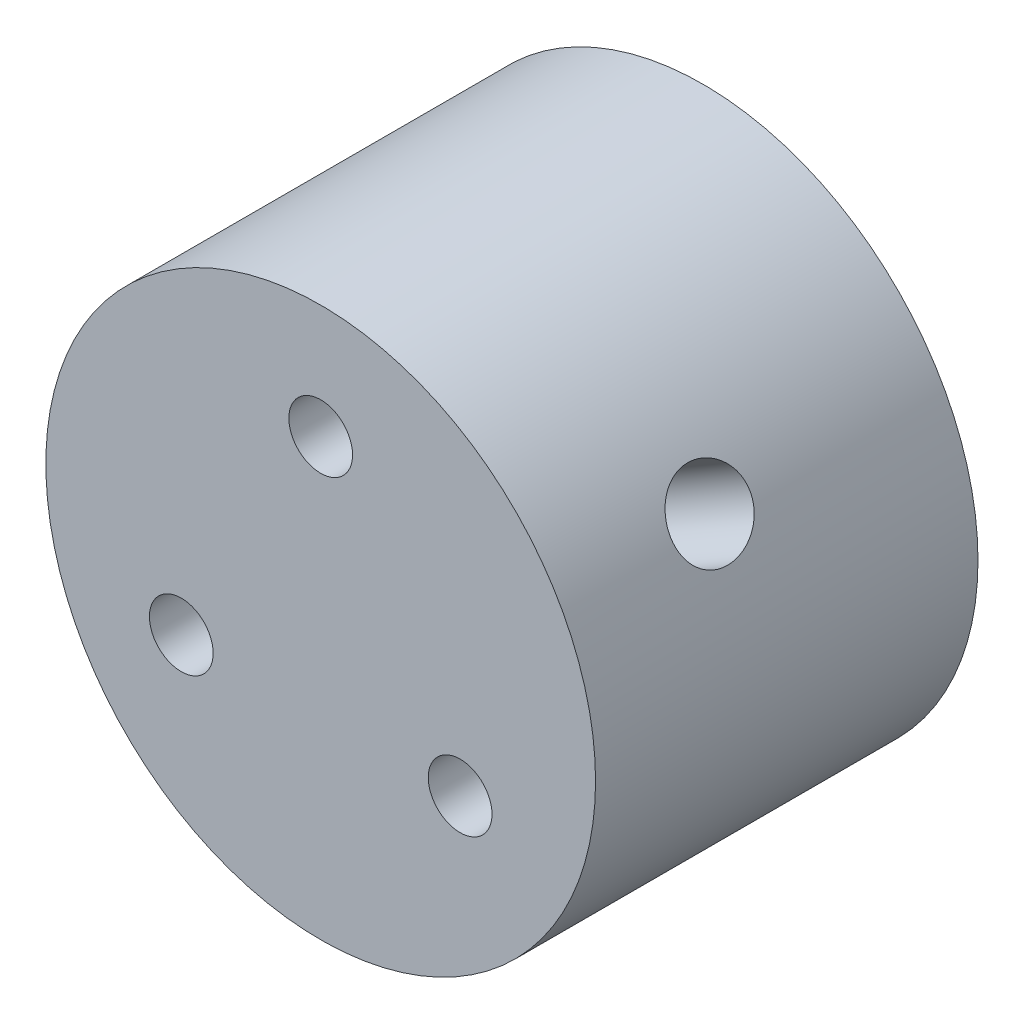
ISO-10303-21;
HEADER;
FILE_DESCRIPTION(('STEP AP214'),'2;1');
FILE_NAME('part.step','',(''),(''),'','','');
FILE_SCHEMA(('AUTOMOTIVE_DESIGN { 1 0 10303 214 1 1 1 1 }'));
ENDSEC;
DATA;
#1=APPLICATION_CONTEXT('core data for automotive mechanical design processes');
#2=APPLICATION_PROTOCOL_DEFINITION('international standard','automotive_design',2000,#1);
#3=PRODUCT_CONTEXT('',#1,'mechanical');
#4=PRODUCT('Part','Part','',(#3));
#5=PRODUCT_RELATED_PRODUCT_CATEGORY('part','',(#4));
#6=PRODUCT_DEFINITION_FORMATION('','',#4);
#7=PRODUCT_DEFINITION_CONTEXT('part definition',#1,'design');
#8=PRODUCT_DEFINITION('design','',#6,#7);
#9=PRODUCT_DEFINITION_SHAPE('','',#8);
#10=(LENGTH_UNIT() NAMED_UNIT(*) SI_UNIT(.MILLI.,.METRE.));
#11=(NAMED_UNIT(*) PLANE_ANGLE_UNIT() SI_UNIT($,.RADIAN.));
#12=(NAMED_UNIT(*) SI_UNIT($,.STERADIAN.) SOLID_ANGLE_UNIT());
#13=UNCERTAINTY_MEASURE_WITH_UNIT(LENGTH_MEASURE(1.E-05),#10,'distance_accuracy_value','');
#14=(GEOMETRIC_REPRESENTATION_CONTEXT(3) GLOBAL_UNCERTAINTY_ASSIGNED_CONTEXT((#13)) GLOBAL_UNIT_ASSIGNED_CONTEXT((#10,
#11,#12)) REPRESENTATION_CONTEXT('',''));
#15=CARTESIAN_POINT('',(0.,0.,0.));
#16=DIRECTION('',(0.,0.,1.));
#17=DIRECTION('',(1.,0.,0.));
#18=AXIS2_PLACEMENT_3D('',#15,#16,#17);
#19=CARTESIAN_POINT('',(0.,0.,48.));
#20=DIRECTION('',(0.,0.,-1.));
#21=DIRECTION('',(-1.,0.,0.));
#22=AXIS2_PLACEMENT_3D('',#19,#20,#21);
#23=CYLINDRICAL_SURFACE('',#22,34.5);
#24=CARTESIAN_POINT('',(-27.0624339322728,21.3980062076206,29.));
#25=CARTESIAN_POINT('',(-27.062432378259,21.3980074335611,29.1396811536221));
#26=CARTESIAN_POINT('',(-27.066105505621,21.3933649615511,29.279336303075));
#27=CARTESIAN_POINT('',(-27.0807519140724,21.3748221823608,29.5576893388665));
#28=CARTESIAN_POINT('',(-27.091726758129,21.360919893072,29.6963870138294));
#29=CARTESIAN_POINT('',(-27.1208594669716,21.3239192747357,29.9718821731124));
#30=CARTESIAN_POINT('',(-27.1390223267007,21.3008145508563,30.1086782674564));
#31=CARTESIAN_POINT('',(-27.1823242689643,21.2455284651499,30.3793537740703));
#32=CARTESIAN_POINT('',(-27.207465909831,21.2133437746523,30.5132320972744));
#33=CARTESIAN_POINT('',(-27.2643987102191,21.1401208395038,30.7769264216718));
#34=CARTESIAN_POINT('',(-27.2961823553729,21.0990925982832,30.9067468245692));
#35=CARTESIAN_POINT('',(-27.3660682832039,21.0083693903759,31.1616259617749));
#36=CARTESIAN_POINT('',(-27.4041728937342,20.9586712304259,31.2866829208852));
#37=CARTESIAN_POINT('',(-27.4862480899361,20.8509171943618,31.5310568049867));
#38=CARTESIAN_POINT('',(-27.5302155934857,20.79286570833,31.6503767014127));
#39=CARTESIAN_POINT('',(-27.623573979753,20.6686766618153,31.8825727148244));
#40=CARTESIAN_POINT('',(-27.672966873776,20.6025361015062,31.9954464183422));
#41=CARTESIAN_POINT('',(-27.776970731533,20.4621009946115,32.2146237177126));
#42=CARTESIAN_POINT('',(-27.831612716077,20.3877575319849,32.3208812550878));
#43=CARTESIAN_POINT('',(-27.9453025481956,20.23164329573,32.5253467604931));
#44=CARTESIAN_POINT('',(-28.004352018596,20.1498697839432,32.6235517353811));
#45=CARTESIAN_POINT('',(-28.1262231320909,19.9794029893045,32.8111579681905));
#46=CARTESIAN_POINT('',(-28.1890435872609,19.8907118830048,32.9005619753809));
#47=CARTESIAN_POINT('',(-28.3178791557431,19.7068597864432,33.0700074073955));
#48=CARTESIAN_POINT('',(-28.3838954386103,19.6116964223353,33.1500453674104));
#49=CARTESIAN_POINT('',(-28.5187467165314,19.4150804874584,33.3004633455947));
#50=CARTESIAN_POINT('',(-28.5875922056008,19.3136036168492,33.370802207607));
#51=CARTESIAN_POINT('',(-28.7272222380825,19.1052985706319,33.5009441983494));
#52=CARTESIAN_POINT('',(-28.798007492842,18.99846841965,33.5607434005993));
#53=CARTESIAN_POINT('',(-28.9408224951166,18.780196348426,33.6693112397603));
#54=CARTESIAN_POINT('',(-29.0128517220236,18.6687563314362,33.7180843762251));
#55=CARTESIAN_POINT('',(-29.157547350558,18.4419519854754,33.8042801186226));
#56=CARTESIAN_POINT('',(-29.2302139756485,18.3265862357531,33.8416985655615));
#57=CARTESIAN_POINT('',(-29.4471550533404,17.9774678759682,33.935961705267));
#58=CARTESIAN_POINT('',(-29.5915453473279,17.7389054260518,33.9757015416059));
#59=CARTESIAN_POINT('',(-29.8756808704555,17.2560800139875,34.0078723393638));
#60=CARTESIAN_POINT('',(-30.0154263410687,17.0118173493073,34.0003057640073));
#61=CARTESIAN_POINT('',(-30.2854075278283,16.5263614845206,33.9383998980575));
#62=CARTESIAN_POINT('',(-30.4157066743588,16.2851590006362,33.8844116255055));
#63=CARTESIAN_POINT('',(-30.6648018210252,15.8111255500393,33.7317286681408));
#64=CARTESIAN_POINT('',(-30.7835975411898,15.5782947871652,33.6330328955648));
#65=CARTESIAN_POINT('',(-31.0077643383555,15.127203064434,33.3933785432124));
#66=CARTESIAN_POINT('',(-31.1130862894942,14.908996728946,33.2522712580146));
#67=CARTESIAN_POINT('',(-31.3082104672409,14.4947736287041,32.9319066846693));
#68=CARTESIAN_POINT('',(-31.3980117386625,14.2987582298993,32.7526470500322));
#69=CARTESIAN_POINT('',(-31.5618486944441,13.93342162128,32.3591082918331));
#70=CARTESIAN_POINT('',(-31.6357320435591,13.7643620513244,32.1445227242422));
#71=CARTESIAN_POINT('',(-31.7661125038639,13.4607386472375,31.6874669495281));
#72=CARTESIAN_POINT('',(-31.8226095210322,13.3261749996533,31.4449965916197));
#73=CARTESIAN_POINT('',(-31.9179803945846,13.0961109976948,30.9387485144721));
#74=CARTESIAN_POINT('',(-31.9568420100665,13.0006377808448,30.6749561445886));
#75=CARTESIAN_POINT('',(-32.0167715895902,12.8523458602228,30.1337165816403));
#76=CARTESIAN_POINT('',(-32.0378407203525,12.7995243596263,29.8562702851778));
#77=CARTESIAN_POINT('',(-32.0620443347773,12.7387750297312,29.2982879233041));
#78=CARTESIAN_POINT('',(-32.0653394388819,12.7304451450529,29.0178025611778));
#79=CARTESIAN_POINT('',(-32.0544233532874,12.7579055206322,28.4593508668561));
#80=CARTESIAN_POINT('',(-32.0402126694863,12.7936945059026,28.1813844620994));
#81=CARTESIAN_POINT('',(-31.994412770818,12.9077985493021,27.6371791758897));
#82=CARTESIAN_POINT('',(-31.9629045566277,12.9859153731322,27.3708918327572));
#83=CARTESIAN_POINT('',(-31.8826341898198,13.1817590032483,26.8560779496545));
#84=CARTESIAN_POINT('',(-31.8338712375033,13.2994876453959,26.6075522335174));
#85=CARTESIAN_POINT('',(-31.7188709520665,13.5714810777314,26.133391586281));
#86=CARTESIAN_POINT('',(-31.6525129444351,13.7259973964214,25.907930236263));
#87=CARTESIAN_POINT('',(-31.5028991727562,14.0659784301217,25.4880799299139));
#88=CARTESIAN_POINT('',(-31.4196425186108,14.251444775263,25.2936926113016));
#89=CARTESIAN_POINT('',(-31.2363159262727,14.6489163450975,24.9399763822613));
#90=CARTESIAN_POINT('',(-31.1361206541505,14.8611161546788,24.7809309273419));
#91=CARTESIAN_POINT('',(-30.9207465939507,15.3041822423588,24.5043863838868));
#92=CARTESIAN_POINT('',(-30.8055681934024,15.5350480376148,24.3868862210999));
#93=CARTESIAN_POINT('',(-30.5627862598416,16.0073848505066,24.1972189604037));
#94=CARTESIAN_POINT('',(-30.4352275221049,16.2488160174629,24.1248949847653));
#95=CARTESIAN_POINT('',(-30.1701535162243,16.735843890318,24.0271430586428));
#96=CARTESIAN_POINT('',(-30.0326388606292,16.9814403392325,24.0017122255506));
#97=CARTESIAN_POINT('',(-29.8225481612858,17.3460453379166,23.9992737523232));
#98=CARTESIAN_POINT('',(-29.7521772013637,17.4664634717714,24.0043196651362));
#99=CARTESIAN_POINT('',(-29.6104584943827,17.7056488234044,24.0260392538203));
#100=CARTESIAN_POINT('',(-29.5391111222391,17.8244166414082,24.0427085829848));
#101=CARTESIAN_POINT('',(-29.395960977944,18.0595251232147,24.0875629399824));
#102=CARTESIAN_POINT('',(-29.324158051117,18.1758648979859,24.1157521106829));
#103=CARTESIAN_POINT('',(-29.1807233893489,18.4052620343925,24.1834202629379));
#104=CARTESIAN_POINT('',(-29.1090916018578,18.5183205686913,24.2228951550347));
#105=CARTESIAN_POINT('',(-28.9665969724545,18.7404286939835,24.3128350674625));
#106=CARTESIAN_POINT('',(-28.895733916404,18.8494794227155,24.3632969401914));
#107=CARTESIAN_POINT('',(-28.7553963055681,19.0628824679722,24.4748300814823));
#108=CARTESIAN_POINT('',(-28.6859212595868,19.167236463586,24.5358975199888));
#109=CARTESIAN_POINT('',(-28.5489288627992,19.3706920160596,24.6682429350668));
#110=CARTESIAN_POINT('',(-28.4814122617839,19.4697915729706,24.7395247617651));
#111=CARTESIAN_POINT('',(-28.3490092534541,19.662077669385,24.8917525203313));
#112=CARTESIAN_POINT('',(-28.2841219200766,19.7552662974506,24.9726950092494));
#113=CARTESIAN_POINT('',(-28.156986957563,19.9360580658387,25.1444844123258));
#114=CARTESIAN_POINT('',(-28.0947688105816,20.0236024944788,25.2354149469377));
#115=CARTESIAN_POINT('',(-27.974245605206,20.1916386765307,25.4258978837172));
#116=CARTESIAN_POINT('',(-27.9159391455184,20.2721329587254,25.5254471687795));
#117=CARTESIAN_POINT('',(-27.8037719827395,20.4257022637268,25.7325697162863));
#118=CARTESIAN_POINT('',(-27.7499139766517,20.4987727917542,25.8401477722614));
#119=CARTESIAN_POINT('',(-27.6472638877794,20.6370107143001,26.062490734272));
#120=CARTESIAN_POINT('',(-27.5984699422377,20.7021810163198,26.1772529726062));
#121=CARTESIAN_POINT('',(-27.506189498586,20.8246357184986,26.4138704555592));
#122=CARTESIAN_POINT('',(-27.4627343144749,20.8818738224466,26.5357618836751));
#123=CARTESIAN_POINT('',(-27.3819510461969,20.9876913495253,26.7851441504622));
#124=CARTESIAN_POINT('',(-27.3446207111576,21.0362739541047,26.9126329101909));
#125=CARTESIAN_POINT('',(-27.2765186229426,21.1245032901575,27.1722575429742));
#126=CARTESIAN_POINT('',(-27.2457419916817,21.1641566691486,27.3043898737517));
#127=CARTESIAN_POINT('',(-27.1910778142365,21.2343415285726,27.5724011690972));
#128=CARTESIAN_POINT('',(-27.1671887059592,21.2648750774432,27.70827927645));
#129=CARTESIAN_POINT('',(-27.1189534124847,21.3263792814157,28.0343993732283));
#130=CARTESIAN_POINT('',(-27.0977965823854,21.3532183302098,28.2259162745531));
#131=CARTESIAN_POINT('',(-27.0695380042923,21.3890308370826,28.6116388854967));
#132=CARTESIAN_POINT('',(-27.0624360923367,21.3980045035753,28.8058445637222));
#133=CARTESIAN_POINT('',(-27.0624339322728,21.3980062076206,29.));
#134=B_SPLINE_CURVE_WITH_KNOTS('',3,(#24,#25,#26,#27,#28,#29,#30,#31,#32,#33,#34,#35,#36,#37,
#38,#39,#40,#41,#42,#43,#44,#45,#46,#47,#48,#49,#50,#51,#52,#53,#54,#55,#56,#57,#58,#59,#60,#61,
#62,#63,#64,#65,#66,#67,#68,#69,#70,#71,#72,#73,#74,#75,#76,#77,#78,#79,#80,#81,#82,#83,#84,#85,
#86,#87,#88,#89,#90,#91,#92,#93,#94,#95,#96,#97,#98,#99,#100,#101,#102,#103,#104,#105,#106,#107,
#108,#109,#110,#111,#112,#113,#114,#115,#116,#117,#118,#119,#120,#121,#122,#123,#124,#125,#126,
#127,#128,#129,#130,#131,#132,#133),.UNSPECIFIED.,.T.,.F.,(4,2,2,2,2,2,2,2,2,2,2,2,2,2,2,2,2,2,
2,2,2,2,2,2,2,2,2,2,2,2,2,2,2,2,2,2,2,2,2,2,2,2,2,2,2,2,2,2,2,2,2,2,2,2,4),(0.,
0.418873384797761,0.837836460289055,1.25709118533762,1.67649980724655,2.09543647942797,
2.51452777940979,2.93339962539417,3.35242728336616,3.77410460824125,4.19593796694443,
4.61763913128664,5.03949580689117,5.46309081168777,5.88684329195409,6.31042253247804,
6.7341567347837,7.57476445837881,8.41532841225428,9.2495917747853,10.0838754365914,
10.921119124664,11.7584143207467,12.6033977804718,13.4483858096019,14.2939594593115,
15.1394776572507,15.9773421091499,16.8151823482507,17.6491322170659,18.4831207417042,
19.3229841045516,20.1628917167849,21.0093103218027,21.8557070390787,22.6991479969593,
23.5425371052365,23.9608212293198,24.3789490152013,24.7972273044072,25.2153542193204,
25.6333615045102,26.0512181447876,26.4692327048201,26.8870987316,27.3087769082443,
27.7303032104317,28.1520832273616,28.573707543284,28.9976974287552,29.4215311478941,
29.8450482857167,30.2684692939876,30.8507059910492,31.432935895812),.UNSPECIFIED.);
#135=CARTESIAN_POINT('',(-27.0624339322728,21.3980062076206,29.));
#136=VERTEX_POINT('',#135);
#137=EDGE_CURVE('E69',#136,#136,#134,.T.);
#138=ORIENTED_EDGE('',*,*,#137,.T.);
#139=EDGE_LOOP('',(#138));
#140=FACE_BOUND('',#139,.T.);
#141=CARTESIAN_POINT('',(32.062433932273,12.7377521697758,29.));
#142=CARTESIAN_POINT('',(32.0624342169618,12.7377502109901,29.1396811536221));
#143=CARTESIAN_POINT('',(32.0602502819457,12.7432524686019,29.279336303075));
#144=CARTESIAN_POINT('',(32.0515149683359,12.7652080199902,29.5576893388665));
#145=CARTESIAN_POINT('',(32.0449626546693,12.7816636583902,29.6963870138294));
#146=CARTESIAN_POINT('',(32.0274855336556,12.8253936334971,29.9718821731124));
#147=CARTESIAN_POINT('',(32.0165576856932,12.8526754933675,30.1086782674564));
#148=CARTESIAN_POINT('',(31.9903295021274,12.9178191182543,30.3793537740703));
#149=CARTESIAN_POINT('',(31.9750275629769,12.9556847631864,30.5132320972744));
#150=CARTESIAN_POINT('',(31.9400810411927,13.0416014822053,30.7769264216718));
#151=CARTESIAN_POINT('',(31.9204413646,13.0896410469438,30.9067468245692));
#152=CARTESIAN_POINT('',(31.8768157257549,13.1955256397661,31.1616259617749));
#153=CARTESIAN_POINT('',(31.852828161982,13.2533742804617,31.2866829208852));
#154=CARTESIAN_POINT('',(31.8005480274912,13.3783305034251,31.5310568049867));
#155=CARTESIAN_POINT('',(31.772257717635,13.445433221456,31.6503767014127));
#156=CARTESIAN_POINT('',(31.7113860416152,13.5883784788771,31.8825727148244));
#157=CARTESIAN_POINT('',(31.6788030831785,13.664224260022,31.9954464183422));
#158=CARTESIAN_POINT('',(31.609184641903,13.8245117963785,32.2146237177126));
#159=CARTESIAN_POINT('',(31.572122306935,13.9090048744201,32.3208812550878));
#160=CARTESIAN_POINT('',(31.4937683285052,14.0855202753143,32.5253467604931));
#161=CARTESIAN_POINT('',(31.4524751251414,14.1775453726544,32.6235517353811));
#162=CARTESIAN_POINT('',(31.36578210723,14.3683222502479,32.8111579681905));
#163=CARTESIAN_POINT('',(31.3203835836697,14.4670719134522,32.9005619753809));
#164=CARTESIAN_POINT('',(31.2255807817494,14.6705728369496,33.0700074073955));
#165=CARTESIAN_POINT('',(31.176175032356,14.77532629703,33.1500453674104));
#166=CARTESIAN_POINT('',(31.0733262769243,14.9904188968809,33.3004633455947));
#167=CARTESIAN_POINT('',(31.0198674736149,15.1007792746556,33.370802207607));
#168=CARTESIAN_POINT('',(30.9092850280951,15.3258549530246,33.5009441983494));
#169=CARTESIAN_POINT('',(30.8521600308344,15.4405718573507,33.5607434005993));
#170=CARTESIAN_POINT('',(30.734538373355,15.6733893129739,33.6693112397603));
#171=CARTESIAN_POINT('',(30.6740431010972,15.7914884617853,33.7180843762251));
#172=CARTESIAN_POINT('',(30.5499725900736,16.0302007248931,33.8042801186226));
#173=CARTESIAN_POINT('',(30.4863962326327,16.1508147430898,33.8416985655615));
#174=CARTESIAN_POINT('',(30.2925214029775,16.5132504073879,33.935961705267));
#175=CARTESIAN_POINT('',(30.1581154079545,16.7575772949991,33.9757015416059));
#176=CARTESIAN_POINT('',(29.882044097078,17.2450585821774,34.0078723393638));
#177=CARTESIAN_POINT('',(29.7403791595754,17.4882130421323,34.0003057640073));
#178=CARTESIAN_POINT('',(29.4549526416338,17.9647515408033,33.9383998980575));
#179=CARTESIAN_POINT('',(29.3112147363992,18.1981951537324,33.8844116255055));
#180=CARTESIAN_POINT('',(29.025237299272,18.6509346040034,33.7317286681408));
#181=CARTESIAN_POINT('',(28.8829978039227,18.8702300969638,33.6330328955648));
#182=CARTESIAN_POINT('',(28.6044243111835,19.2899100993599,33.3933785432124));
#183=CARTESIAN_POINT('',(28.4681130569535,19.4902247523662,33.2522712580146));
#184=CARTESIAN_POINT('',(28.2069474181831,19.8663187973083,32.9319066846693));
#185=CARTESIAN_POINT('',(28.082093738996,20.042096679054,32.7526470500322));
#186=CARTESIAN_POINT('',(27.84762143289,20.3666519491492,32.3591082918331));
#187=CARTESIAN_POINT('',(27.7381532251131,20.5151665913773,32.1445227242422));
#188=CARTESIAN_POINT('',(27.5403978741427,20.7798910842017,31.6874669495281));
#189=CARTESIAN_POINT('',(27.452110845493,20.8961007600997,31.4449965916197));
#190=CARTESIAN_POINT('',(27.3005550120768,21.0937263603564,30.9387485144721));
#191=CARTESIAN_POINT('',(27.2373035886447,21.1751181150209,30.6749561445886));
#192=CARTESIAN_POINT('',(27.1388438079719,21.3011646136375,30.1337165816403));
#193=CARTESIAN_POINT('',(27.1036336119705,21.3458217664115,29.8562702851778));
#194=CARTESIAN_POINT('',(27.0631249562308,21.3971573763144,29.2982879233041));
#195=CARTESIAN_POINT('',(27.0575586165412,21.4041759625162,29.0178025611778));
#196=CARTESIAN_POINT('',(27.075881956593,21.3809921672918,28.4593508668561));
#197=CARTESIAN_POINT('',(27.0997707851123,21.3507908614798,28.1813844620994));
#198=CARTESIAN_POINT('',(27.1756878360366,21.2540749640424,27.6371791758897));
#199=CARTESIAN_POINT('',(27.2275848828413,21.1877296382107,27.3708918327573));
#200=CARTESIAN_POINT('',(27.3570552582872,21.0202916463259,26.8560779496545));
#201=CARTESIAN_POINT('',(27.4346297769819,20.9191973697826,26.6075522335174));
#202=CARTESIAN_POINT('',(27.6126828563285,20.683607484984,26.133391586281));
#203=CARTESIAN_POINT('',(27.7133189097977,20.5488816052857,25.907930236263));
#204=CARTESIAN_POINT('',(27.9329442359476,20.2493217614057,25.4880799299139));
#205=CARTESIAN_POINT('',(28.0519344753143,20.0844862113111,25.2936926113016));
#206=CARTESIAN_POINT('',(28.3044916559039,19.7269849402397,24.9399763822613));
#207=CARTESIAN_POINT('',(28.4381644456185,19.5341133844521,24.7809309273419));
#208=CARTESIAN_POINT('',(28.7141839030048,19.1260609331629,24.5043863838868));
#209=CARTESIAN_POINT('',(28.8565303462873,18.9108806146928,24.3868862210999));
#210=CARTESIAN_POINT('',(29.1441950586138,18.4644568862033,24.1972189604037));
#211=CARTESIAN_POINT('',(29.2895012135949,18.2332721953705,24.1248949847653));
#212=CARTESIAN_POINT('',(29.5787427208982,17.7601974359675,24.0271430586428));
#213=CARTESIAN_POINT('',(29.7226781569399,17.5183080263723,24.0017122255506));
#214=CARTESIAN_POINT('',(29.9333899984754,17.1540616442999,23.9992737523232));
#215=CARTESIAN_POINT('',(30.0024896815089,17.0329095383913,24.0043196651362));
#216=CARTESIAN_POINT('',(30.1387709187457,16.7905848621378,24.0260392538203));
#217=CARTESIAN_POINT('',(30.2059531802172,16.6694123163663,24.0427085829848));
#218=CARTESIAN_POINT('',(30.3379880259593,16.4278864139481,24.0875629399824));
#219=CARTESIAN_POINT('',(30.4028397629682,16.3075333678642,24.1157521106829));
#220=CARTESIAN_POINT('',(30.5297861797677,16.0686167387865,24.1834202629379));
#221=CARTESIAN_POINT('',(30.5918818488395,15.9500525239513,24.2228951550347));
#222=CARTESIAN_POINT('',(30.7129858130278,15.7155944923391,24.3128350674625));
#223=CARTESIAN_POINT('',(30.7719949863857,15.5996999212436,24.3632969401914));
#224=CARTESIAN_POINT('',(30.8866386394051,15.3714624625249,24.4748300814823));
#225=CARTESIAN_POINT('',(30.9422743276024,15.2591183099692,24.5358975199888));
#226=CARTESIAN_POINT('',(31.0499758061917,15.0387516379889,24.6682429350668));
#227=CARTESIAN_POINT('',(31.1020402394728,14.930730767877,24.7395247617651));
#228=CARTESIAN_POINT('',(31.2023633795973,14.7199233509187,24.8917525203313));
#229=CARTESIAN_POINT('',(31.2506234321571,14.6171349577972,24.9726950092494));
#230=CARTESIAN_POINT('',(31.3436262151196,14.4166369663572,25.1444844123258));
#231=CARTESIAN_POINT('',(31.388332840791,14.3189822561748,25.2354149469377));
#232=CARTESIAN_POINT('',(31.4735948405151,14.1305880075481,25.4258978837172));
#233=CARTESIAN_POINT('',(31.5141517039112,14.0398459911566,25.5254471687795));
#234=CARTESIAN_POINT('',(31.5910630418945,13.8659217262189,25.7325697162863));
#235=CARTESIAN_POINT('',(31.6274149723903,13.782744060736,25.8401477722614));
#236=CARTESIAN_POINT('',(31.6958074806453,13.6247275147989,26.062490734272));
#237=CARTESIAN_POINT('',(31.7278496449958,13.549885567399,26.1772529726062));
#238=CARTESIAN_POINT('',(31.7877583060697,13.4087410078348,26.4138704555592));
#239=CARTESIAN_POINT('',(31.8156003660975,13.3424886624944,26.5357618836751));
#240=CARTESIAN_POINT('',(31.8668493985743,13.2196195364257,26.7851441504622));
#241=CARTESIAN_POINT('',(31.8902580008024,13.1629992156601,26.9126329101909));
#242=CARTESIAN_POINT('',(31.9326158030757,13.0599064091887,27.1722575429742));
#243=CARTESIAN_POINT('',(31.9515683209974,13.0134263751783,27.3043898737517));
#244=CARTESIAN_POINT('',(31.985018103497,12.9309933791218,27.5724011690972));
#245=CARTESIAN_POINT('',(31.999516378348,12.8950380300446,27.70827927645));
#246=CARTESIAN_POINT('',(32.0286629346905,12.8225129385504,28.0343993732283));
#247=CARTESIAN_POINT('',(32.04132781771,12.7907710618238,28.2259162745531));
#248=CARTESIAN_POINT('',(32.0582130693885,12.748392161884,28.6116388854967));
#249=CARTESIAN_POINT('',(32.0624335365584,12.7377548924687,28.8058445637222));
#250=CARTESIAN_POINT('',(32.062433932273,12.7377521697758,29.));
#251=B_SPLINE_CURVE_WITH_KNOTS('',3,(#141,#142,#143,#144,#145,#146,#147,#148,#149,#150,#151,
#152,#153,#154,#155,#156,#157,#158,#159,#160,#161,#162,#163,#164,#165,#166,#167,#168,#169,#170,
#171,#172,#173,#174,#175,#176,#177,#178,#179,#180,#181,#182,#183,#184,#185,#186,#187,#188,#189,
#190,#191,#192,#193,#194,#195,#196,#197,#198,#199,#200,#201,#202,#203,#204,#205,#206,#207,#208,
#209,#210,#211,#212,#213,#214,#215,#216,#217,#218,#219,#220,#221,#222,#223,#224,#225,#226,#227,
#228,#229,#230,#231,#232,#233,#234,#235,#236,#237,#238,#239,#240,#241,#242,#243,#244,#245,#246,
#247,#248,#249,#250),.UNSPECIFIED.,.T.,.F.,(4,2,2,2,2,2,2,2,2,2,2,2,2,2,2,2,2,2,2,2,2,2,2,2,2,2,
2,2,2,2,2,2,2,2,2,2,2,2,2,2,2,2,2,2,2,2,2,2,2,2,2,2,2,2,4),(0.,0.418873384797761,
0.837836460289055,1.25709118533762,1.67649980724655,2.09543647942797,2.51452777940979,
2.93339962539417,3.35242728336616,3.77410460824125,4.19593796694443,4.61763913128663,
5.03949580689117,5.46309081168778,5.88684329195409,6.31042253247804,6.73415673478369,
7.57476445837881,8.41532841225427,9.24959177478529,10.0838754365914,10.921119124664,
11.7584143207467,12.6033977804718,13.4483858096019,14.2939594593115,15.1394776572507,
15.9773421091499,16.8151823482507,17.6491322170659,18.4831207417042,19.3229841045516,
20.1628917167849,21.0093103218027,21.8557070390787,22.6991479969593,23.5425371052365,
23.9608212293198,24.3789490152013,24.7972273044073,25.2153542193204,25.6333615045102,
26.0512181447876,26.4692327048201,26.8870987316,27.3087769082443,27.7303032104317,
28.1520832273616,28.573707543284,28.9976974287552,29.4215311478941,29.8450482857167,
30.2684692939876,30.8507059910492,31.432935895812),.UNSPECIFIED.);
#252=CARTESIAN_POINT('',(32.062433932273,12.7377521697758,29.));
#253=VERTEX_POINT('',#252);
#254=EDGE_CURVE('E60',#253,#253,#251,.T.);
#255=ORIENTED_EDGE('',*,*,#254,.T.);
#256=EDGE_LOOP('',(#255));
#257=FACE_BOUND('',#256,.T.);
#258=CARTESIAN_POINT('',(0.,-34.5,34.));
#259=CARTESIAN_POINT('',(0.139689818065339,-34.5000007051837,34.0000018370424));
#260=CARTESIAN_POINT('',(0.279353632082252,-34.4991499702517,33.9941440552333));
#261=CARTESIAN_POINT('',(0.557724230848582,-34.4957723113589,33.9707593887931));
#262=CARTESIAN_POINT('',(0.69643080437194,-34.4932450286902,33.9532300069466));
#263=CARTESIAN_POINT('',(0.9719439548344,-34.4865819187669,33.9066140930778));
#264=CARTESIAN_POINT('',(1.10874914433517,-34.482444974839,33.8775195376229));
#265=CARTESIAN_POINT('',(1.37944303424332,-34.4726773851782,33.8079799169434));
#266=CARTESIAN_POINT('',(1.51333064612,-34.4670461919359,33.7675306909279));
#267=CARTESIAN_POINT('',(1.77704472979558,-34.4544557497779,33.6756377343697));
#268=CARTESIAN_POINT('',(1.90687556257476,-34.447497988382,33.6242063108115));
#269=CARTESIAN_POINT('',(2.16177466440575,-34.4324416554255,33.5106765747636));
#270=CARTESIAN_POINT('',(2.28684115811077,-34.424342663787,33.448574332576));
#271=CARTESIAN_POINT('',(2.53123241001508,-34.4072356059039,33.3141973235436));
#272=CARTESIAN_POINT('',(2.65056014594458,-34.3982280187944,33.2419279103595));
#273=CARTESIAN_POINT('',(2.88276968674275,-34.3795464506311,33.0876735786396));
#274=CARTESIAN_POINT('',(2.99564907748692,-34.369872222953,33.0056850563433));
#275=CARTESIAN_POINT('',(3.21481859626601,-34.350067327095,32.8320500764228));
#276=CARTESIAN_POINT('',(3.32106376247753,-34.3399342105896,32.740347140934));
#277=CARTESIAN_POINT('',(3.52550441384206,-34.3195480494129,32.5483087166174));
#278=CARTESIAN_POINT('',(3.62369690595885,-34.309294961754,32.4479700461838));
#279=CARTESIAN_POINT('',(3.81127871723102,-34.2889640361817,32.2394164002987));
#280=CARTESIAN_POINT('',(3.90067076798666,-34.2788861446935,32.1312038870894));
#281=CARTESIAN_POINT('',(4.07009320913557,-34.2591829966624,31.9075808933052));
#282=CARTESIAN_POINT('',(4.15012013422061,-34.2495579084498,31.7921677724085));
#283=CARTESIAN_POINT('',(4.30052559630811,-34.2309983602264,31.5544748261872));
#284=CARTESIAN_POINT('',(4.37086190945984,-34.2220669922425,31.432168031613));
#285=CARTESIAN_POINT('',(4.50099854006384,-34.2051943307637,31.181950754193));
#286=CARTESIAN_POINT('',(4.5607949307969,-34.1972534065861,31.0540382049524));
#287=CARTESIAN_POINT('',(4.66935698501973,-34.1825995890939,30.7935968639766));
#288=CARTESIAN_POINT('',(4.71812716140857,-34.1758861935822,30.6610699865545));
#289=CARTESIAN_POINT('',(4.80431687270855,-34.1638757287357,30.3922985865416));
#290=CARTESIAN_POINT('',(4.84173224969594,-34.158579178308,30.2560527219815));
#291=CARTESIAN_POINT('',(4.93598669808496,-34.145135397486,29.8452232563782));
#292=CARTESIAN_POINT('',(4.97571984693311,-34.1393102818569,29.5664150690971));
#293=CARTESIAN_POINT('',(5.00787315974064,-34.1346076581074,29.0061848481093));
#294=CARTESIAN_POINT('',(5.0002958623203,-34.135729777207,28.7247629554598));
#295=CARTESIAN_POINT('',(4.93837275056611,-34.1447422961832,28.1694018153331));
#296=CARTESIAN_POINT('',(4.88438875736362,-34.1525803322372,27.8954215529572));
#297=CARTESIAN_POINT('',(4.73173393980025,-34.1740629659404,27.3604603237847));
#298=CARTESIAN_POINT('',(4.63306192846248,-34.1877077178237,27.0994797024814));
#299=CARTESIAN_POINT('',(4.39345732160264,-34.2193237181954,26.5968066384993));
#300=CARTESIAN_POINT('',(4.25237056812282,-34.2373107008917,26.3551886979907));
#301=CARTESIAN_POINT('',(3.93205011163047,-34.2755731836978,25.8989207584741));
#302=CARTESIAN_POINT('',(3.75281406917767,-34.2958488241199,25.6842724146151));
#303=CARTESIAN_POINT('',(3.3592923894242,-34.3366357832656,25.2859375203383));
#304=CARTESIAN_POINT('',(3.14469540703887,-34.3571475361895,25.1025584563002));
#305=CARTESIAN_POINT('',(2.68760687297792,-34.3959196691684,24.7743725353431));
#306=CARTESIAN_POINT('',(2.44511521338684,-34.4141800405131,24.6295658276553));
#307=CARTESIAN_POINT('',(1.93886066014738,-34.4464092357637,24.3826226725704));
#308=CARTESIAN_POINT('',(1.67508651380652,-34.460375770367,24.2805089769804));
#309=CARTESIAN_POINT('',(1.13388666539479,-34.4824242140997,24.1221127518462));
#310=CARTESIAN_POINT('',(0.856461825493712,-34.4905064943672,24.0658273317451));
#311=CARTESIAN_POINT('',(0.298490549011583,-34.499826824613,24.0010920129155));
#312=CARTESIAN_POINT('',(0.0179941515664671,-34.5011253822749,23.9922191992046));
#313=CARTESIAN_POINT('',(-0.540482317742548,-34.4968963728193,24.021439823419));
#314=CARTESIAN_POINT('',(-0.818462461949523,-34.4913690025814,24.0595319067408));
#315=CARTESIAN_POINT('',(-1.36274176366782,-34.4741466495462,24.1812493936833));
#316=CARTESIAN_POINT('',(-1.6290877401969,-34.4624794541753,24.2646697071417));
#317=CARTESIAN_POINT('',(-2.14401225726796,-34.4342818371216,24.4744601172261));
#318=CARTESIAN_POINT('',(-2.39259001133029,-34.4177512003324,24.6008321136108));
#319=CARTESIAN_POINT('',(-2.86678791237467,-34.3815144025999,24.8939372920308));
#320=CARTESIAN_POINT('',(-3.09223990003729,-34.3617873504954,25.060939898334));
#321=CARTESIAN_POINT('',(-3.51206735532052,-34.321421119412,25.4301903013907));
#322=CARTESIAN_POINT('',(-3.70644114189259,-34.3007818911697,25.6324400034562));
#323=CARTESIAN_POINT('',(-4.06012555313532,-34.260726588361,26.0683182622996));
#324=CARTESIAN_POINT('',(-4.21915334896936,-34.2413212091647,26.3021774233749));
#325=CARTESIAN_POINT('',(-4.49566694148288,-34.2061178034467,26.7935481851977));
#326=CARTESIAN_POINT('',(-4.61315380091396,-34.1903196846432,27.0510591806425));
#327=CARTESIAN_POINT('',(-4.80281279819231,-34.164194232133,27.5815124847594));
#328=CARTESIAN_POINT('',(-4.87513605889873,-34.1538486718368,27.8543999630999));
#329=CARTESIAN_POINT('',(-4.9728788900081,-34.139757190895,28.4087633770927));
#330=CARTESIAN_POINT('',(-4.99830146613919,-34.1360108473255,28.6902387611957));
#331=CARTESIAN_POINT('',(-5.00072119393696,-34.1356509169154,29.1110472097383));
#332=CARTESIAN_POINT('',(-4.99567045403229,-34.1363935461174,29.2504994070562));
#333=CARTESIAN_POINT('',(-4.97394434758889,-34.1395669428088,29.5284619103846));
#334=CARTESIAN_POINT('',(-4.95727332720433,-34.1419970791447,29.6669725490005));
#335=CARTESIAN_POINT('',(-4.91241884985801,-34.1484793906146,29.9421192260877));
#336=CARTESIAN_POINT('',(-4.88423123839306,-34.1525321510845,30.0787545696596));
#337=CARTESIAN_POINT('',(-4.8165696163839,-34.1621402317787,30.3490969045812));
#338=CARTESIAN_POINT('',(-4.77709969153236,-34.1676950080349,30.4828049371688));
#339=CARTESIAN_POINT('',(-4.68717412010465,-34.1801471028916,30.7463623269102));
#340=CARTESIAN_POINT('',(-4.63672185358725,-34.187044008353,30.8762128573522));
#341=CARTESIAN_POINT('',(-4.52521164458867,-34.2019827033847,31.1311521843674));
#342=CARTESIAN_POINT('',(-4.46415752901128,-34.210024079652,31.2562426793546));
#343=CARTESIAN_POINT('',(-4.33184200204636,-34.2270301552956,31.5008985054929));
#344=CARTESIAN_POINT('',(-4.26057673197668,-34.2359952033559,31.6204617252544));
#345=CARTESIAN_POINT('',(-4.1083847277849,-34.2545916249741,31.8531553683361));
#346=CARTESIAN_POINT('',(-4.02746143401972,-34.2642227607489,31.9662880612481));
#347=CARTESIAN_POINT('',(-3.8556927617305,-34.2839783864933,32.1864252922318));
#348=CARTESIAN_POINT('',(-3.76476165482684,-34.2941066485164,32.2933626109229));
#349=CARTESIAN_POINT('',(-3.57427497442117,-34.3144827653384,32.4991730979946));
#350=CARTESIAN_POINT('',(-3.47472251905228,-34.3247305757486,32.5980491570261));
#351=CARTESIAN_POINT('',(-3.26759110290733,-34.3450677858823,32.7871527379766));
#352=CARTESIAN_POINT('',(-3.16000736047028,-34.3551570868356,32.8773750334076));
#353=CARTESIAN_POINT('',(-2.93765054759084,-34.3748841472607,33.0484415200344));
#354=CARTESIAN_POINT('',(-2.82288014729457,-34.3845220721386,33.1292891628419));
#355=CARTESIAN_POINT('',(-2.58625627787144,-34.4031312060564,33.2814922350549));
#356=CARTESIAN_POINT('',(-2.46436727273268,-34.4120984498475,33.3527929207713));
#357=CARTESIAN_POINT('',(-2.21498950563554,-34.4290492755067,33.4848323339402));
#358=CARTESIAN_POINT('',(-2.08750282264267,-34.4370332184483,33.5455749417669));
#359=CARTESIAN_POINT('',(-1.82788225777066,-34.451788514843,33.6560422904502));
#360=CARTESIAN_POINT('',(-1.69575191092822,-34.458560767769,33.7057752106825));
#361=CARTESIAN_POINT('',(-1.42774499010887,-34.4707056370342,33.7938967366348));
#362=CARTESIAN_POINT('',(-1.29186927226561,-34.4760785703499,33.8322879117733));
#363=CARTESIAN_POINT('',(-0.965726877773798,-34.486997663625,33.9096857612376));
#364=CARTESIAN_POINT('',(-0.774184713637144,-34.4918521115508,33.9435164275692));
#365=CARTESIAN_POINT('',(-0.388411596695475,-34.4983527716117,33.9886721439006));
#366=CARTESIAN_POINT('',(-0.194180674076361,-34.4999990197349,33.9999974463556));
#367=CARTESIAN_POINT('',(0.,-34.5,34.));
#368=B_SPLINE_CURVE_WITH_KNOTS('',3,(#258,#259,#260,#261,#262,#263,#264,#265,#266,#267,#268,
#269,#270,#271,#272,#273,#274,#275,#276,#277,#278,#279,#280,#281,#282,#283,#284,#285,#286,#287,
#288,#289,#290,#291,#292,#293,#294,#295,#296,#297,#298,#299,#300,#301,#302,#303,#304,#305,#306,
#307,#308,#309,#310,#311,#312,#313,#314,#315,#316,#317,#318,#319,#320,#321,#322,#323,#324,#325,
#326,#327,#328,#329,#330,#331,#332,#333,#334,#335,#336,#337,#338,#339,#340,#341,#342,#343,#344,
#345,#346,#347,#348,#349,#350,#351,#352,#353,#354,#355,#356,#357,#358,#359,#360,#361,#362,#363,
#364,#365,#366,#367),.UNSPECIFIED.,.T.,.F.,(4,2,2,2,2,2,2,2,2,2,2,2,2,2,2,2,2,2,2,2,2,2,2,2,2,2,
2,2,2,2,2,2,2,2,2,2,2,2,2,2,2,2,2,2,2,2,2,2,2,2,2,2,2,2,4),(0.,0.418899407755692,
0.837888470594361,1.2571687192116,1.67660280935707,2.09556931281417,2.51469043930521,
2.93359169225888,3.35264875885577,3.77429187364566,4.19609100205565,4.61775879119457,
5.03958211688018,5.46318890774231,5.88695318412914,6.31054370355343,6.73428914758301,
7.57493111461137,8.41552797421457,9.24962975008854,10.0837536821836,10.9209466935785,
11.75819105921,12.6032451894744,13.4483025890893,14.2938097614017,15.1392636003533,
15.9771633435248,16.8150389198087,17.6491546700402,18.4833073181289,19.3231497259495,
20.1630375462628,21.0094215867369,21.855783972401,22.6992989350453,23.5427598373967,
23.9609893244996,24.379062471557,24.7972865679652,25.2153594032812,25.633303748897,
26.0510975433631,26.4690496359102,26.8868532885037,27.308564965644,27.7301247518242,
28.1519375589998,28.573594564316,28.9975743738583,29.4213980285476,29.8449057492838,
30.2683174526543,30.8506296280882,31.4329352713681),.UNSPECIFIED.);
#369=CARTESIAN_POINT('',(0.,-34.5,34.));
#370=VERTEX_POINT('',#369);
#371=EDGE_CURVE('E11',#370,#370,#368,.T.);
#372=ORIENTED_EDGE('',*,*,#371,.T.);
#373=EDGE_LOOP('',(#372));
#374=FACE_BOUND('',#373,.T.);
#375=CARTESIAN_POINT('',(0.,0.,48.));
#376=DIRECTION('',(0.,0.,1.));
#377=DIRECTION('',(1.,0.,0.));
#378=AXIS2_PLACEMENT_3D('',#375,#376,#377);
#379=CIRCLE('',#378,34.5);
#380=CARTESIAN_POINT('',(34.5,0.,48.));
#381=VERTEX_POINT('',#380);
#382=EDGE_CURVE('E46',#381,#381,#379,.T.);
#383=ORIENTED_EDGE('',*,*,#382,.F.);
#384=EDGE_LOOP('',(#383));
#385=FACE_BOUND('',#384,.T.);
#386=CARTESIAN_POINT('',(0.,0.,0.));
#387=DIRECTION('',(0.,0.,1.));
#388=DIRECTION('',(1.,0.,0.));
#389=AXIS2_PLACEMENT_3D('',#386,#387,#388);
#390=CIRCLE('',#389,34.5);
#391=CARTESIAN_POINT('',(34.5,0.,0.));
#392=VERTEX_POINT('',#391);
#393=EDGE_CURVE('E138',#392,#392,#390,.T.);
#394=ORIENTED_EDGE('',*,*,#393,.T.);
#395=EDGE_LOOP('',(#394));
#396=FACE_BOUND('',#395,.T.);
#397=ADVANCED_FACE('F35',(#140,#257,#374,#385,#396),#23,.T.);
#398=CARTESIAN_POINT('',(0.,0.,48.));
#399=DIRECTION('',(0.,0.,1.));
#400=DIRECTION('',(1.,0.,0.));
#401=AXIS2_PLACEMENT_3D('',#398,#399,#400);
#402=PLANE('',#401);
#403=CARTESIAN_POINT('',(-17.5,-10.1036297108185,48.));
#404=DIRECTION('',(0.,0.,1.));
#405=DIRECTION('',(1.,0.,0.));
#406=AXIS2_PLACEMENT_3D('',#403,#404,#405);
#407=CIRCLE('',#406,4.);
#408=CARTESIAN_POINT('',(-13.5,-10.1036297108185,48.));
#409=VERTEX_POINT('',#408);
#410=EDGE_CURVE('E72',#409,#409,#407,.T.);
#411=ORIENTED_EDGE('',*,*,#410,.F.);
#412=EDGE_LOOP('',(#411));
#413=FACE_BOUND('',#412,.T.);
#414=CARTESIAN_POINT('',(17.5,-10.1036297108184,48.));
#415=DIRECTION('',(0.,0.,1.));
#416=DIRECTION('',(1.,0.,0.));
#417=AXIS2_PLACEMENT_3D('',#414,#415,#416);
#418=CIRCLE('',#417,4.);
#419=CARTESIAN_POINT('',(21.5,-10.1036297108184,48.));
#420=VERTEX_POINT('',#419);
#421=EDGE_CURVE('E148',#420,#420,#418,.T.);
#422=ORIENTED_EDGE('',*,*,#421,.F.);
#423=EDGE_LOOP('',(#422));
#424=FACE_BOUND('',#423,.T.);
#425=CARTESIAN_POINT('',(0.,20.2072594216369,48.));
#426=DIRECTION('',(0.,0.,1.));
#427=DIRECTION('',(1.,0.,0.));
#428=AXIS2_PLACEMENT_3D('',#425,#426,#427);
#429=CIRCLE('',#428,4.);
#430=CARTESIAN_POINT('',(4.,20.2072594216369,48.));
#431=VERTEX_POINT('',#430);
#432=EDGE_CURVE('E142',#431,#431,#429,.T.);
#433=ORIENTED_EDGE('',*,*,#432,.F.);
#434=EDGE_LOOP('',(#433));
#435=FACE_BOUND('',#434,.T.);
#436=ORIENTED_EDGE('',*,*,#382,.T.);
#437=EDGE_LOOP('',(#436));
#438=FACE_BOUND('',#437,.T.);
#439=ADVANCED_FACE('F116',(#413,#424,#435,#438),#402,.T.);
#440=CARTESIAN_POINT('',(0.,0.,0.));
#441=DIRECTION('',(0.,0.,1.));
#442=DIRECTION('',(1.,0.,0.));
#443=AXIS2_PLACEMENT_3D('',#440,#441,#442);
#444=PLANE('',#443);
#445=ORIENTED_EDGE('',*,*,#393,.F.);
#446=EDGE_LOOP('',(#445));
#447=FACE_BOUND('',#446,.T.);
#448=ADVANCED_FACE('F114',(#447),#444,.F.);
#449=CARTESIAN_POINT('',(0.,20.2072594216369,8.));
#450=DIRECTION('',(0.,0.,1.));
#451=DIRECTION('',(1.,0.,0.));
#452=AXIS2_PLACEMENT_3D('',#449,#450,#451);
#453=CYLINDRICAL_SURFACE('',#452,4.);
#454=CARTESIAN_POINT('',(0.,20.2072594216369,8.));
#455=DIRECTION('',(0.,0.,1.));
#456=DIRECTION('',(1.,0.,0.));
#457=AXIS2_PLACEMENT_3D('',#454,#455,#456);
#458=CIRCLE('',#457,4.);
#459=CARTESIAN_POINT('',(4.,20.2072594216369,8.));
#460=VERTEX_POINT('',#459);
#461=EDGE_CURVE('E139',#460,#460,#458,.T.);
#462=ORIENTED_EDGE('',*,*,#461,.F.);
#463=EDGE_LOOP('',(#462));
#464=FACE_BOUND('',#463,.T.);
#465=ORIENTED_EDGE('',*,*,#432,.T.);
#466=EDGE_LOOP('',(#465));
#467=FACE_BOUND('',#466,.T.);
#468=ADVANCED_FACE('F110',(#464,#467),#453,.F.);
#469=CARTESIAN_POINT('',(0.,20.2072594216369,8.));
#470=DIRECTION('',(0.,0.,1.));
#471=DIRECTION('',(1.,0.,0.));
#472=AXIS2_PLACEMENT_3D('',#469,#470,#471);
#473=PLANE('',#472);
#474=ORIENTED_EDGE('',*,*,#461,.T.);
#475=EDGE_LOOP('',(#474));
#476=FACE_BOUND('',#475,.T.);
#477=ADVANCED_FACE('F106',(#476),#473,.T.);
#478=CARTESIAN_POINT('',(17.5,-10.1036297108184,8.));
#479=DIRECTION('',(0.,0.,1.));
#480=DIRECTION('',(1.,0.,0.));
#481=AXIS2_PLACEMENT_3D('',#478,#479,#480);
#482=CYLINDRICAL_SURFACE('',#481,4.);
#483=CARTESIAN_POINT('',(17.5,-10.1036297108184,8.));
#484=DIRECTION('',(0.,0.,1.));
#485=DIRECTION('',(1.,0.,0.));
#486=AXIS2_PLACEMENT_3D('',#483,#484,#485);
#487=CIRCLE('',#486,4.);
#488=CARTESIAN_POINT('',(21.5,-10.1036297108184,8.));
#489=VERTEX_POINT('',#488);
#490=EDGE_CURVE('E146',#489,#489,#487,.T.);
#491=ORIENTED_EDGE('',*,*,#490,.F.);
#492=EDGE_LOOP('',(#491));
#493=FACE_BOUND('',#492,.T.);
#494=ORIENTED_EDGE('',*,*,#421,.T.);
#495=EDGE_LOOP('',(#494));
#496=FACE_BOUND('',#495,.T.);
#497=ADVANCED_FACE('F102',(#493,#496),#482,.F.);
#498=CARTESIAN_POINT('',(17.5,-10.1036297108184,8.));
#499=DIRECTION('',(0.,0.,1.));
#500=DIRECTION('',(1.,0.,0.));
#501=AXIS2_PLACEMENT_3D('',#498,#499,#500);
#502=PLANE('',#501);
#503=ORIENTED_EDGE('',*,*,#490,.T.);
#504=EDGE_LOOP('',(#503));
#505=FACE_BOUND('',#504,.T.);
#506=ADVANCED_FACE('F98',(#505),#502,.T.);
#507=CARTESIAN_POINT('',(-17.5,-10.1036297108185,8.));
#508=DIRECTION('',(0.,0.,1.));
#509=DIRECTION('',(1.,0.,0.));
#510=AXIS2_PLACEMENT_3D('',#507,#508,#509);
#511=CYLINDRICAL_SURFACE('',#510,4.);
#512=CARTESIAN_POINT('',(-17.5,-10.1036297108185,8.));
#513=DIRECTION('',(0.,0.,1.));
#514=DIRECTION('',(1.,0.,0.));
#515=AXIS2_PLACEMENT_3D('',#512,#513,#514);
#516=CIRCLE('',#515,4.);
#517=CARTESIAN_POINT('',(-13.5,-10.1036297108185,8.));
#518=VERTEX_POINT('',#517);
#519=EDGE_CURVE('E83',#518,#518,#516,.T.);
#520=ORIENTED_EDGE('',*,*,#519,.F.);
#521=EDGE_LOOP('',(#520));
#522=FACE_BOUND('',#521,.T.);
#523=ORIENTED_EDGE('',*,*,#410,.T.);
#524=EDGE_LOOP('',(#523));
#525=FACE_BOUND('',#524,.T.);
#526=ADVANCED_FACE('F94',(#522,#525),#511,.F.);
#527=CARTESIAN_POINT('',(-17.5,-10.1036297108185,8.));
#528=DIRECTION('',(0.,0.,1.));
#529=DIRECTION('',(1.,0.,0.));
#530=AXIS2_PLACEMENT_3D('',#527,#528,#529);
#531=PLANE('',#530);
#532=ORIENTED_EDGE('',*,*,#519,.T.);
#533=EDGE_LOOP('',(#532));
#534=FACE_BOUND('',#533,.T.);
#535=ADVANCED_FACE('F91',(#534),#531,.T.);
#536=CARTESIAN_POINT('',(0.,-34.5,29.));
#537=DIRECTION('',(0.,1.,0.));
#538=DIRECTION('',(0.,0.,1.));
#539=AXIS2_PLACEMENT_3D('',#536,#537,#538);
#540=CYLINDRICAL_SURFACE('',#539,5.);
#541=CARTESIAN_POINT('',(0.,0.,29.));
#542=DIRECTION('',(0.500000000000004,0.866025403784436,0.));
#543=DIRECTION('',(-0.866025403784436,0.500000000000004,0.));
#544=AXIS2_PLACEMENT_3D('',#541,#542,#543);
#545=ELLIPSE('',#544,5.77350269189628,5.);
#546=CARTESIAN_POINT('',(0.,0.,34.));
#547=VERTEX_POINT('',#546);
#548=CARTESIAN_POINT('',(0.,0.,24.));
#549=VERTEX_POINT('',#548);
#550=EDGE_CURVE('E55',#547,#549,#545,.T.);
#551=ORIENTED_EDGE('',*,*,#550,.T.);
#552=CARTESIAN_POINT('',(0.,0.,29.));
#553=DIRECTION('',(-0.499999999999998,0.86602540378444,0.));
#554=DIRECTION('',(0.86602540378444,0.499999999999998,0.));
#555=AXIS2_PLACEMENT_3D('',#552,#553,#554);
#556=ELLIPSE('',#555,5.77350269189625,5.);
#557=EDGE_CURVE('E65',#549,#547,#556,.T.);
#558=ORIENTED_EDGE('',*,*,#557,.T.);
#559=EDGE_LOOP('',(#551,#558));
#560=FACE_BOUND('',#559,.T.);
#561=ORIENTED_EDGE('',*,*,#371,.F.);
#562=EDGE_LOOP('',(#561));
#563=FACE_BOUND('',#562,.T.);
#564=ADVANCED_FACE('F67',(#560,#563),#540,.F.);
#565=CARTESIAN_POINT('',(-40.8139382152815,23.5639382152818,29.));
#566=DIRECTION('',(0.866025403784436,-0.500000000000004,0.));
#567=DIRECTION('',(0.500000000000004,0.866025403784436,0.));
#568=AXIS2_PLACEMENT_3D('',#565,#566,#567);
#569=CYLINDRICAL_SURFACE('',#568,5.);
#570=CARTESIAN_POINT('',(0.,0.,29.));
#571=DIRECTION('',(1.,0.,0.));
#572=DIRECTION('',(0.,-1.,0.));
#573=AXIS2_PLACEMENT_3D('',#570,#571,#572);
#574=ELLIPSE('',#573,5.77350269189625,5.);
#575=EDGE_CURVE('E52',#549,#547,#574,.T.);
#576=ORIENTED_EDGE('',*,*,#575,.T.);
#577=ORIENTED_EDGE('',*,*,#557,.F.);
#578=EDGE_LOOP('',(#576,#577));
#579=FACE_BOUND('',#578,.T.);
#580=ORIENTED_EDGE('',*,*,#137,.F.);
#581=EDGE_LOOP('',(#580));
#582=FACE_BOUND('',#581,.T.);
#583=ADVANCED_FACE('F63',(#579,#582),#569,.F.);
#584=CARTESIAN_POINT('',(40.8139382152817,23.5639382152811,29.));
#585=DIRECTION('',(-0.866025403784443,-0.499999999999992,0.));
#586=DIRECTION('',(0.499999999999992,-0.866025403784443,0.));
#587=AXIS2_PLACEMENT_3D('',#584,#585,#586);
#588=CYLINDRICAL_SURFACE('',#587,5.);
#589=ORIENTED_EDGE('',*,*,#575,.F.);
#590=ORIENTED_EDGE('',*,*,#550,.F.);
#591=EDGE_LOOP('',(#589,#590));
#592=FACE_BOUND('',#591,.T.);
#593=ORIENTED_EDGE('',*,*,#254,.F.);
#594=EDGE_LOOP('',(#593));
#595=FACE_BOUND('',#594,.T.);
#596=ADVANCED_FACE('F56',(#592,#595),#588,.F.);
#597=CLOSED_SHELL('',(#397,#439,#448,#468,#477,#497,#506,#526,#535,#564,#583,#596));
#598=MANIFOLD_SOLID_BREP('B2',#597);
#599=ADVANCED_BREP_SHAPE_REPRESENTATION('',(#18,#598),#14);
#600=SHAPE_DEFINITION_REPRESENTATION(#9,#599);
ENDSEC;
END-ISO-10303-21;
